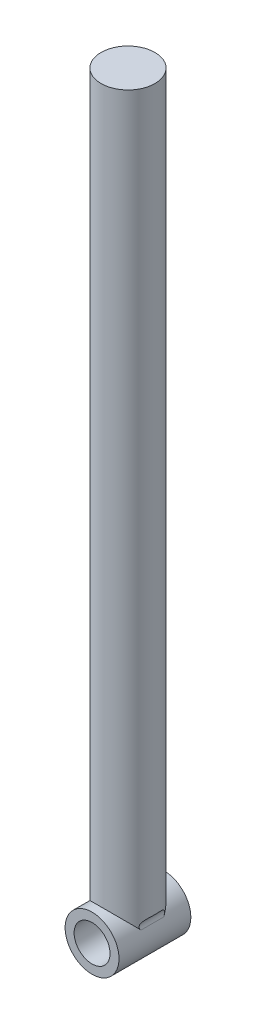
ISO-10303-21;
HEADER;
FILE_DESCRIPTION(('STEP AP214'),'2;1');
FILE_NAME('part.step','',(''),(''),'','','');
FILE_SCHEMA(('AUTOMOTIVE_DESIGN { 1 0 10303 214 1 1 1 1 }'));
ENDSEC;
DATA;
#1=APPLICATION_CONTEXT('core data for automotive mechanical design processes');
#2=APPLICATION_PROTOCOL_DEFINITION('international standard','automotive_design',2000,#1);
#3=PRODUCT_CONTEXT('',#1,'mechanical');
#4=PRODUCT('Part','Part','',(#3));
#5=PRODUCT_RELATED_PRODUCT_CATEGORY('part','',(#4));
#6=PRODUCT_DEFINITION_FORMATION('','',#4);
#7=PRODUCT_DEFINITION_CONTEXT('part definition',#1,'design');
#8=PRODUCT_DEFINITION('design','',#6,#7);
#9=PRODUCT_DEFINITION_SHAPE('','',#8);
#10=(LENGTH_UNIT() NAMED_UNIT(*) SI_UNIT(.MILLI.,.METRE.));
#11=(NAMED_UNIT(*) PLANE_ANGLE_UNIT() SI_UNIT($,.RADIAN.));
#12=(NAMED_UNIT(*) SI_UNIT($,.STERADIAN.) SOLID_ANGLE_UNIT());
#13=UNCERTAINTY_MEASURE_WITH_UNIT(LENGTH_MEASURE(1.E-05),#10,'distance_accuracy_value','');
#14=(GEOMETRIC_REPRESENTATION_CONTEXT(3) GLOBAL_UNCERTAINTY_ASSIGNED_CONTEXT((#13)) GLOBAL_UNIT_ASSIGNED_CONTEXT((#10,
#11,#12)) REPRESENTATION_CONTEXT('',''));
#15=CARTESIAN_POINT('',(0.,0.,0.));
#16=DIRECTION('',(0.,0.,1.));
#17=DIRECTION('',(1.,0.,0.));
#18=AXIS2_PLACEMENT_3D('',#15,#16,#17);
#19=CARTESIAN_POINT('',(0.,0.,100.));
#20=DIRECTION('',(0.,0.,-1.));
#21=DIRECTION('',(-1.,0.,0.));
#22=AXIS2_PLACEMENT_3D('',#19,#20,#21);
#23=CYLINDRICAL_SURFACE('',#22,37.5);
#24=CARTESIAN_POINT('',(0.,0.,0.));
#25=DIRECTION('',(0.,0.,1.));
#26=DIRECTION('',(1.,0.,0.));
#27=AXIS2_PLACEMENT_3D('',#24,#25,#26);
#28=CIRCLE('',#27,37.5);
#29=CARTESIAN_POINT('',(37.5,0.,0.));
#30=VERTEX_POINT('',#29);
#31=EDGE_CURVE('E116',#30,#30,#28,.T.);
#32=ORIENTED_EDGE('',*,*,#31,.T.);
#33=EDGE_LOOP('',(#32));
#34=FACE_BOUND('',#33,.T.);
#35=CARTESIAN_POINT('',(0.,0.,100.));
#36=DIRECTION('',(0.,0.,1.));
#37=DIRECTION('',(1.,0.,0.));
#38=AXIS2_PLACEMENT_3D('',#35,#36,#37);
#39=CIRCLE('',#38,37.5);
#40=CARTESIAN_POINT('',(37.5,0.,100.));
#41=VERTEX_POINT('',#40);
#42=EDGE_CURVE('E121',#41,#41,#39,.T.);
#43=ORIENTED_EDGE('',*,*,#42,.F.);
#44=EDGE_LOOP('',(#43));
#45=FACE_BOUND('',#44,.T.);
#46=CARTESIAN_POINT('',(0.,0.,50.));
#47=DIRECTION('',(0.,-0.707106781186547,-0.707106781186547));
#48=DIRECTION('',(0.,0.707106781186547,-0.707106781186547));
#49=AXIS2_PLACEMENT_3D('',#46,#47,#48);
#50=ELLIPSE('',#49,53.0330085889911,37.5);
#51=CARTESIAN_POINT('',(34.0138577755541,15.7894736842105,34.2105263157895));
#52=VERTEX_POINT('',#51);
#53=CARTESIAN_POINT('',(-34.0138577755541,15.7894736842105,34.2105263157895));
#54=VERTEX_POINT('',#53);
#55=EDGE_CURVE('E56',#52,#54,#50,.F.);
#56=ORIENTED_EDGE('',*,*,#55,.F.);
#57=DIRECTION('',(0.,0.,-1.));
#58=VECTOR('',#57,1.);
#59=CARTESIAN_POINT('',(34.0138577755541,15.7894736842105,100.));
#60=LINE('',#59,#58);
#61=CARTESIAN_POINT('',(34.0138577755541,15.7894736842105,65.7894736842105));
#62=VERTEX_POINT('',#61);
#63=EDGE_CURVE('E72',#52,#62,#60,.F.);
#64=ORIENTED_EDGE('',*,*,#63,.T.);
#65=CARTESIAN_POINT('',(0.,0.,50.));
#66=DIRECTION('',(0.,0.707106781186547,-0.707106781186547));
#67=DIRECTION('',(0.,-0.707106781186547,-0.707106781186547));
#68=AXIS2_PLACEMENT_3D('',#65,#66,#67);
#69=ELLIPSE('',#68,53.0330085889911,37.5);
#70=CARTESIAN_POINT('',(-34.0138577755541,15.7894736842105,65.7894736842105));
#71=VERTEX_POINT('',#70);
#72=EDGE_CURVE('E62',#71,#62,#69,.T.);
#73=ORIENTED_EDGE('',*,*,#72,.F.);
#74=DIRECTION('',(0.,0.,-1.));
#75=VECTOR('',#74,1.);
#76=CARTESIAN_POINT('',(-34.0138577755541,15.7894736842105,100.));
#77=LINE('',#76,#75);
#78=EDGE_CURVE('E69',#71,#54,#77,.T.);
#79=ORIENTED_EDGE('',*,*,#78,.T.);
#80=EDGE_LOOP('',(#56,#64,#73,#79));
#81=FACE_BOUND('',#80,.T.);
#82=ADVANCED_FACE('F33',(#34,#45,#81),#23,.T.);
#83=CARTESIAN_POINT('',(0.,0.,100.));
#84=DIRECTION('',(0.,0.,1.));
#85=DIRECTION('',(1.,0.,0.));
#86=AXIS2_PLACEMENT_3D('',#83,#84,#85);
#87=PLANE('',#86);
#88=ORIENTED_EDGE('',*,*,#42,.T.);
#89=EDGE_LOOP('',(#88));
#90=FACE_BOUND('',#89,.T.);
#91=CARTESIAN_POINT('',(0.,0.,100.));
#92=DIRECTION('',(0.,0.,1.));
#93=DIRECTION('',(1.,0.,0.));
#94=AXIS2_PLACEMENT_3D('',#91,#92,#93);
#95=CIRCLE('',#94,25.);
#96=CARTESIAN_POINT('',(25.,0.,100.));
#97=VERTEX_POINT('',#96);
#98=EDGE_CURVE('E109',#97,#97,#95,.T.);
#99=ORIENTED_EDGE('',*,*,#98,.F.);
#100=EDGE_LOOP('',(#99));
#101=FACE_BOUND('',#100,.T.);
#102=ADVANCED_FACE('F91',(#90,#101),#87,.T.);
#103=CARTESIAN_POINT('',(0.,0.,0.));
#104=DIRECTION('',(0.,0.,1.));
#105=DIRECTION('',(1.,0.,0.));
#106=AXIS2_PLACEMENT_3D('',#103,#104,#105);
#107=PLANE('',#106);
#108=ORIENTED_EDGE('',*,*,#31,.F.);
#109=EDGE_LOOP('',(#108));
#110=FACE_BOUND('',#109,.T.);
#111=CARTESIAN_POINT('',(0.,0.,0.));
#112=DIRECTION('',(0.,0.,1.));
#113=DIRECTION('',(1.,0.,0.));
#114=AXIS2_PLACEMENT_3D('',#111,#112,#113);
#115=CIRCLE('',#114,25.);
#116=CARTESIAN_POINT('',(25.,0.,0.));
#117=VERTEX_POINT('',#116);
#118=EDGE_CURVE('E112',#117,#117,#115,.T.);
#119=ORIENTED_EDGE('',*,*,#118,.T.);
#120=EDGE_LOOP('',(#119));
#121=FACE_BOUND('',#120,.T.);
#122=ADVANCED_FACE('F93',(#110,#121),#107,.F.);
#123=CARTESIAN_POINT('',(0.,0.,100.));
#124=DIRECTION('',(0.,0.,-1.));
#125=DIRECTION('',(-1.,0.,0.));
#126=AXIS2_PLACEMENT_3D('',#123,#124,#125);
#127=CYLINDRICAL_SURFACE('',#126,25.);
#128=ORIENTED_EDGE('',*,*,#98,.T.);
#129=EDGE_LOOP('',(#128));
#130=FACE_BOUND('',#129,.T.);
#131=ORIENTED_EDGE('',*,*,#118,.F.);
#132=EDGE_LOOP('',(#131));
#133=FACE_BOUND('',#132,.T.);
#134=ADVANCED_FACE('F96',(#130,#133),#127,.F.);
#135=CARTESIAN_POINT('',(0.,1030.,50.));
#136=DIRECTION('',(0.,-1.,0.));
#137=DIRECTION('',(0.,0.,-1.));
#138=AXIS2_PLACEMENT_3D('',#135,#136,#137);
#139=CYLINDRICAL_SURFACE('',#138,37.5);
#140=CARTESIAN_POINT('',(0.,1030.,50.));
#141=DIRECTION('',(0.,1.,0.));
#142=DIRECTION('',(0.,0.,1.));
#143=AXIS2_PLACEMENT_3D('',#140,#141,#142);
#144=CIRCLE('',#143,37.5);
#145=CARTESIAN_POINT('',(0.,1030.,87.5));
#146=VERTEX_POINT('',#145);
#147=EDGE_CURVE('E114',#146,#146,#144,.T.);
#148=ORIENTED_EDGE('',*,*,#147,.F.);
#149=EDGE_LOOP('',(#148));
#150=FACE_BOUND('',#149,.T.);
#151=ORIENTED_EDGE('',*,*,#72,.T.);
#152=CARTESIAN_POINT('',(34.0138577755541,15.7894736842105,65.7894736842105));
#153=CARTESIAN_POINT('',(33.9642878820312,15.8962872373078,65.8962634843181));
#154=CARTESIAN_POINT('',(33.9154762374389,16.0063536010358,66.0000897885189));
#155=CARTESIAN_POINT('',(33.8198875735482,16.2333813568825,66.2011600220385));
#156=CARTESIAN_POINT('',(33.773112617909,16.3503494720273,66.298397328142));
#157=CARTESIAN_POINT('',(33.635931878879,16.7140804915408,66.5806501815352));
#158=CARTESIAN_POINT('',(33.5496039439611,16.9717155827864,66.7542118682542));
#159=CARTESIAN_POINT('',(33.432718927983,17.3791752114855,66.9856097414164));
#160=CARTESIAN_POINT('',(33.3957532526067,17.5190138203539,67.0581171558005));
#161=CARTESIAN_POINT('',(33.3269731714086,17.8050653826979,67.1921058884076));
#162=CARTESIAN_POINT('',(33.2951559972247,17.9512748564987,67.2535931341296));
#163=CARTESIAN_POINT('',(33.2375792410671,18.248842165094,67.3642511322928));
#164=CARTESIAN_POINT('',(33.2117985932779,18.4001799205467,67.4134647566718));
#165=CARTESIAN_POINT('',(33.1668893929903,18.7074633952213,67.4988508529805));
#166=CARTESIAN_POINT('',(33.1477601040685,18.8634086022411,67.5350247686535));
#167=CARTESIAN_POINT('',(33.1175894019325,19.1701038676809,67.5919372094657));
#168=CARTESIAN_POINT('',(33.1061679762356,19.3206815639534,67.613401940402));
#169=CARTESIAN_POINT('',(33.0901608367519,19.6234837925999,67.643456281645));
#170=CARTESIAN_POINT('',(33.0855749493653,19.775708283052,67.6520462189285));
#171=CARTESIAN_POINT('',(33.0833819399097,20.0804606076228,67.6561560035756));
#172=CARTESIAN_POINT('',(33.0857783675997,20.232988556628,67.6516692028187));
#173=CARTESIAN_POINT('',(33.0974822717815,20.5368282997225,67.6297141481021));
#174=CARTESIAN_POINT('',(33.1067892809154,20.6881401753544,67.6122467720097));
#175=CARTESIAN_POINT('',(33.1304511417152,20.9694624262956,67.5676906174669));
#176=CARTESIAN_POINT('',(33.1440311462645,21.0997747205266,67.5420744920933));
#177=CARTESIAN_POINT('',(33.17595776447,21.3576632454756,67.481618501095));
#178=CARTESIAN_POINT('',(33.1943058026236,21.4852386461676,67.4467758789032));
#179=CARTESIAN_POINT('',(33.2559292381143,21.8626694282765,67.3291969246159));
#180=CARTESIAN_POINT('',(33.3058050125325,22.1074673722929,67.2333705191858));
#181=CARTESIAN_POINT('',(33.4406932507744,22.6670903228514,66.9705323531215));
#182=CARTESIAN_POINT('',(33.5318756308039,22.9741513281362,66.7903004503929));
#183=CARTESIAN_POINT('',(33.7312620874311,23.5519163179604,66.3860511230212));
#184=CARTESIAN_POINT('',(33.8395022932417,23.8225408196063,66.1619405114563));
#185=CARTESIAN_POINT('',(34.0366764576925,24.2643658374633,65.7414866928417));
#186=CARTESIAN_POINT('',(34.1236254710339,24.4434601082312,65.5523210480317));
#187=CARTESIAN_POINT('',(34.300177503638,24.7830163358762,65.158966558348));
#188=CARTESIAN_POINT('',(34.3897818641468,24.9434686679984,64.9547700411877));
#189=CARTESIAN_POINT('',(34.5697053163528,25.247309187281,64.534026610829));
#190=CARTESIAN_POINT('',(34.6600251549495,25.3906760245813,64.3174647353636));
#191=CARTESIAN_POINT('',(34.8397744735597,25.6617643499489,63.8743399534406));
#192=CARTESIAN_POINT('',(34.9292036156514,25.7894800934082,63.647773416112));
#193=CARTESIAN_POINT('',(35.0940383557911,26.0144599049136,63.2175701703041));
#194=CARTESIAN_POINT('',(35.1697090461582,26.1135080279007,63.0149604572908));
#195=CARTESIAN_POINT('',(35.3188962731979,26.3019176131673,62.6044954336533));
#196=CARTESIAN_POINT('',(35.3924124759547,26.3912775796493,62.3966393191042));
#197=CARTESIAN_POINT('',(35.6090552384105,26.6461917547014,61.7661559557962));
#198=CARTESIAN_POINT('',(35.7482177763575,26.7985032042426,61.3367646867513));
#199=CARTESIAN_POINT('',(36.0134705457041,27.0739700605959,60.4636961373576));
#200=CARTESIAN_POINT('',(36.1395260347612,27.1970490367188,60.0199847790123));
#201=CARTESIAN_POINT('',(36.3764290454104,27.4183422946209,59.1225401020452));
#202=CARTESIAN_POINT('',(36.4872787784654,27.5165601938534,58.6688082519305));
#203=CARTESIAN_POINT('',(36.6755378520804,27.6773300193163,57.829928548996));
#204=CARTESIAN_POINT('',(36.7554419018824,27.7430976042256,57.4459425895645));
#205=CARTESIAN_POINT('',(36.9034737753542,27.861767303101,56.6736941356446));
#206=CARTESIAN_POINT('',(36.9716001891789,27.9146678771261,56.2854311350809));
#207=CARTESIAN_POINT('',(37.0957801207075,28.0090365183812,55.5053777475623));
#208=CARTESIAN_POINT('',(37.1518265577571,28.0504978845081,55.113585431301));
#209=CARTESIAN_POINT('',(37.2515735969771,28.1230559780464,54.3274974204948));
#210=CARTESIAN_POINT('',(37.2952745814703,28.1541530264326,53.9332018038607));
#211=CARTESIAN_POINT('',(37.3701256841485,28.2067786043814,53.1433795390043));
#212=CARTESIAN_POINT('',(37.4012942079908,28.2283211708562,52.7478555621203));
#213=CARTESIAN_POINT('',(37.4510746016679,28.2624804970135,51.9556413904449));
#214=CARTESIAN_POINT('',(37.469686604136,28.2750973509776,51.5589512080166));
#215=CARTESIAN_POINT('',(37.4942940123023,28.2917399056368,50.7651852282684));
#216=CARTESIAN_POINT('',(37.5002952961254,28.2957696089981,50.3681096969586));
#217=CARTESIAN_POINT('',(37.4996823395263,28.2953561864696,49.573970944401));
#218=CARTESIAN_POINT('',(37.493067892318,28.2909129216981,49.1769077234617));
#219=CARTESIAN_POINT('',(37.4645998010134,28.2716536600422,48.3022532922305));
#220=CARTESIAN_POINT('',(37.4399073746372,28.2549029511491,47.8247927600005));
#221=CARTESIAN_POINT('',(37.3723531733587,28.2083043644452,46.8718430529099));
#222=CARTESIAN_POINT('',(37.3294931148074,28.1784577238372,46.3963536961102));
#223=CARTESIAN_POINT('',(37.2256665937374,28.1044083610313,45.4471665194284));
#224=CARTESIAN_POINT('',(37.1646517027296,28.0601672112162,44.973476967355));
#225=CARTESIAN_POINT('',(37.0248773352917,27.9556280984839,44.0304427714362));
#226=CARTESIAN_POINT('',(36.9461170548797,27.8953294080328,43.5610983254558));
#227=CARTESIAN_POINT('',(36.8015330769604,27.78030512828,42.7893287137332));
#228=CARTESIAN_POINT('',(36.7406224348393,27.7308353797122,42.4851866912432));
#229=CARTESIAN_POINT('',(36.6116195840222,27.6231568388893,41.8799615088542));
#230=CARTESIAN_POINT('',(36.5435271350246,27.5649477541906,41.5788784516773));
#231=CARTESIAN_POINT('',(36.4003722166933,27.4387695396831,40.9801483119276));
#232=CARTESIAN_POINT('',(36.3253039248814,27.370792230371,40.6825043370505));
#233=CARTESIAN_POINT('',(36.1686055703154,27.223974767788,40.0916514395257));
#234=CARTESIAN_POINT('',(36.0869757527234,27.145135020298,39.7984423516607));
#235=CARTESIAN_POINT('',(35.9181445838547,26.9757851037615,39.2191209726603));
#236=CARTESIAN_POINT('',(35.8309804063855,26.8853493464062,38.9329762211585));
#237=CARTESIAN_POINT('',(35.6512421898272,26.6909177120194,38.3669829704599));
#238=CARTESIAN_POINT('',(35.5586674101716,26.5869199763063,38.0871353404647));
#239=CARTESIAN_POINT('',(35.3691188311248,26.3638515164474,37.5356388291751));
#240=CARTESIAN_POINT('',(35.2721530806997,26.2448077080302,37.2639763545157));
#241=CARTESIAN_POINT('',(35.0748118990635,25.9896084090954,36.7301681852002));
#242=CARTESIAN_POINT('',(34.9744380732386,25.8534608959273,36.4680181268449));
#243=CARTESIAN_POINT('',(34.8075873280561,25.613421645646,36.0460155171917));
#244=CARTESIAN_POINT('',(34.7416652724685,25.515131261506,35.8827472950153));
#245=CARTESIAN_POINT('',(34.6095415857095,25.3098712608948,35.5618660446429));
#246=CARTESIAN_POINT('',(34.5433399737957,25.2029022333126,35.4042526337848));
#247=CARTESIAN_POINT('',(34.4112235131831,24.9795565001418,35.0954393239597));
#248=CARTESIAN_POINT('',(34.3453089852004,24.863171210624,34.9442454729506));
#249=CARTESIAN_POINT('',(34.2145921915279,24.6204658102061,34.6495059810931));
#250=CARTESIAN_POINT('',(34.1497899422465,24.4941455528982,34.5059604530074));
#251=CARTESIAN_POINT('',(34.0215561297018,24.2296508242459,34.2263633112012));
#252=CARTESIAN_POINT('',(33.9581457818121,24.0913668975179,34.0904049720306));
#253=CARTESIAN_POINT('',(33.8345263606944,23.8036420793849,33.8291710317021));
#254=CARTESIAN_POINT('',(33.7743176111184,23.6542000636576,33.7038965098092));
#255=CARTESIAN_POINT('',(33.658540023078,23.3442258295003,33.4660911335266));
#256=CARTESIAN_POINT('',(33.6029625643986,23.1837152793981,33.3535364579553));
#257=CARTESIAN_POINT('',(33.4978364026082,22.851603845307,33.1429894237339));
#258=CARTESIAN_POINT('',(33.448286794963,22.6800046312057,33.0449948797132));
#259=CARTESIAN_POINT('',(33.3380229702683,22.2534010387766,32.8289070741472));
#260=CARTESIAN_POINT('',(33.2810666542496,21.9930582412115,32.7190586991198));
#261=CARTESIAN_POINT('',(33.2105229871747,21.5902245011059,32.5840955293961));
#262=CARTESIAN_POINT('',(33.1894867148979,21.4538564171248,32.5440695364166));
#263=CARTESIAN_POINT('',(33.1528429553359,21.1777516841895,32.4745740871684));
#264=CARTESIAN_POINT('',(33.1372333789941,21.0380163536889,32.4451005684965));
#265=CARTESIAN_POINT('',(33.1117672435584,20.7552900139075,32.3971134292601));
#266=CARTESIAN_POINT('',(33.101945655912,20.6122845299385,32.3786664222967));
#267=CARTESIAN_POINT('',(33.0884665752408,20.324955317227,32.3533689543304));
#268=CARTESIAN_POINT('',(33.0848090800335,20.1806315889513,32.3465184892215));
#269=CARTESIAN_POINT('',(33.083762540509,19.892010661208,32.3445572890287));
#270=CARTESIAN_POINT('',(33.0863679182307,19.7477135525198,32.3494361073838));
#271=CARTESIAN_POINT('',(33.097761430939,19.4602385457143,32.3708101760652));
#272=CARTESIAN_POINT('',(33.1065492812552,19.3170605963725,32.3873048915403));
#273=CARTESIAN_POINT('',(33.1291519369301,19.0440190956777,32.4298599632165));
#274=CARTESIAN_POINT('',(33.1425225517494,18.913986180006,32.4550764586624));
#275=CARTESIAN_POINT('',(33.1740149880056,18.6566145688114,32.5146958980764));
#276=CARTESIAN_POINT('',(33.1921385530104,18.5292768805674,32.5491022133153));
#277=CARTESIAN_POINT('',(33.2532171300379,18.1516672541999,32.6656036879784));
#278=CARTESIAN_POINT('',(33.3028285663,17.9063909568275,32.7608861405223));
#279=CARTESIAN_POINT('',(33.402240406352,17.4913710172732,32.9545003334021));
#280=CARTESIAN_POINT('',(33.4490434135429,17.3177958743209,33.0464201403097));
#281=CARTESIAN_POINT('',(33.5491389373054,16.9812188458289,33.2453677781182));
#282=CARTESIAN_POINT('',(33.6024390083161,16.8182296129797,33.3524132197613));
#283=CARTESIAN_POINT('',(33.7135634852374,16.5045245432436,33.5786314003377));
#284=CARTESIAN_POINT('',(33.7713535352313,16.3537306390732,33.697713811996));
#285=CARTESIAN_POINT('',(33.8903420378138,16.0633660560948,33.9465301115385));
#286=CARTESIAN_POINT('',(33.9515311149446,15.923766870556,34.0762351270261));
#287=CARTESIAN_POINT('',(34.0138577755541,15.7894736842105,34.2105263157895));
#288=B_SPLINE_CURVE_WITH_KNOTS('',3,(#152,#153,#154,#155,#156,#157,#158,#159,#160,#161,#162,
#163,#164,#165,#166,#167,#168,#169,#170,#171,#172,#173,#174,#175,#176,#177,#178,#179,#180,#181,
#182,#183,#184,#185,#186,#187,#188,#189,#190,#191,#192,#193,#194,#195,#196,#197,#198,#199,#200,
#201,#202,#203,#204,#205,#206,#207,#208,#209,#210,#211,#212,#213,#214,#215,#216,#217,#218,#219,
#220,#221,#222,#223,#224,#225,#226,#227,#228,#229,#230,#231,#232,#233,#234,#235,#236,#237,#238,
#239,#240,#241,#242,#243,#244,#245,#246,#247,#248,#249,#250,#251,#252,#253,#254,#255,#256,#257,
#258,#259,#260,#261,#262,#263,#264,#265,#266,#267,#268,#269,#270,#271,#272,#273,#274,#275,#276,
#277,#278,#279,#280,#281,#282,#283,#284,#285,#286,#287),.UNSPECIFIED.,.F.,.F.,(4,2,2,2,2,2,2,2,
2,2,2,2,2,2,2,2,2,2,2,2,2,2,2,2,2,2,2,2,2,2,2,2,2,2,2,2,2,2,2,2,2,2,2,2,2,2,2,2,2,2,2,2,2,2,2,2,
2,2,2,2,2,2,2,2,2,2,2,4),(0.,0.476725813261012,0.953923929496935,1.91709481622202,
2.40202752674864,2.88669861501103,3.36965225080255,3.85255239802123,4.30945222424295,
4.76634044653845,5.22346098806225,5.68055061765624,6.08060046419302,6.4807699672834,
7.28039100014535,8.37702792091735,9.47601958134354,10.2988016572965,11.1220066620184,
11.9462297824555,12.770754526972,13.4841120135688,14.1975794822028,15.6250501462625,
17.0562129452556,18.4871673805983,19.67982175802,20.8726188037598,22.066113115121,
23.2595704614404,24.4512685912581,25.6429541330788,26.8340840815401,28.0252335541533,
29.459876576655,30.89438409429,32.3327530373685,33.7711871610537,34.7133012771596,
35.655446926176,36.5983861361559,37.5412901309237,38.4784208805608,39.4156802000638,
40.3512859896916,41.2864570117861,41.8911843700144,42.4958707287586,43.1011146728478,
43.7063675378544,44.3179041695104,44.9295025047884,45.5399357891413,46.1502773591059,
47.0109853184678,47.4415623764704,47.8719734958378,48.3049592127918,48.7379447764345,
49.1705448489954,49.6031250038937,50.0020570536238,50.401135652432,51.2010790596272,
51.8059142529687,52.4114595477194,53.012757539633,53.6124722340481),.UNSPECIFIED.);
#289=EDGE_CURVE('E48',#62,#52,#288,.T.);
#290=ORIENTED_EDGE('',*,*,#289,.T.);
#291=ORIENTED_EDGE('',*,*,#55,.T.);
#292=CARTESIAN_POINT('',(-34.0138577755541,15.7894736842105,34.2105263157895));
#293=CARTESIAN_POINT('',(-33.9642878820312,15.8962872373079,34.1037365156819));
#294=CARTESIAN_POINT('',(-33.9154762374389,16.0063536010358,33.9999102114811));
#295=CARTESIAN_POINT('',(-33.8198875735482,16.2333813568825,33.7988399779615));
#296=CARTESIAN_POINT('',(-33.773112617909,16.3503494720273,33.7016026718581));
#297=CARTESIAN_POINT('',(-33.635931878879,16.7140804915408,33.4193498184648));
#298=CARTESIAN_POINT('',(-33.5496039439611,16.9717155827864,33.2457881317458));
#299=CARTESIAN_POINT('',(-33.432718927983,17.3791752114855,33.0143902585837));
#300=CARTESIAN_POINT('',(-33.3957532526067,17.5190138203539,32.9418828441995));
#301=CARTESIAN_POINT('',(-33.3269731714086,17.8050653826979,32.8078941115924));
#302=CARTESIAN_POINT('',(-33.2951559972247,17.9512748564987,32.7464068658704));
#303=CARTESIAN_POINT('',(-33.2375792410671,18.248842165094,32.6357488677072));
#304=CARTESIAN_POINT('',(-33.2117985932779,18.4001799205467,32.5865352433282));
#305=CARTESIAN_POINT('',(-33.1668893929903,18.7074633952213,32.5011491470195));
#306=CARTESIAN_POINT('',(-33.1477601040685,18.8634086022411,32.4649752313465));
#307=CARTESIAN_POINT('',(-33.1175894019325,19.1701038676809,32.4080627905343));
#308=CARTESIAN_POINT('',(-33.1061679762356,19.3206815639534,32.3865980595981));
#309=CARTESIAN_POINT('',(-33.0901608367519,19.6234837925999,32.356543718355));
#310=CARTESIAN_POINT('',(-33.0855749493653,19.775708283052,32.3479537810715));
#311=CARTESIAN_POINT('',(-33.0833819399097,20.0804606076228,32.3438439964244));
#312=CARTESIAN_POINT('',(-33.0857783675997,20.232988556628,32.3483307971813));
#313=CARTESIAN_POINT('',(-33.0974822717815,20.5368282997224,32.3702858518979));
#314=CARTESIAN_POINT('',(-33.1067892809154,20.6881401753544,32.3877532279903));
#315=CARTESIAN_POINT('',(-33.1304511417151,20.9694624262956,32.4323093825331));
#316=CARTESIAN_POINT('',(-33.1440311462645,21.0997747205266,32.4579255079067));
#317=CARTESIAN_POINT('',(-33.17595776447,21.3576632454756,32.5183814989051));
#318=CARTESIAN_POINT('',(-33.1943058026236,21.4852386461676,32.5532241210968));
#319=CARTESIAN_POINT('',(-33.2559292381143,21.8626694282765,32.6708030753841));
#320=CARTESIAN_POINT('',(-33.3058050125325,22.1074673722929,32.7666294808143));
#321=CARTESIAN_POINT('',(-33.4406932507744,22.6670903228514,33.0294676468786));
#322=CARTESIAN_POINT('',(-33.5318756308039,22.9741513281362,33.2096995496071));
#323=CARTESIAN_POINT('',(-33.7312620874311,23.5519163179604,33.6139488769788));
#324=CARTESIAN_POINT('',(-33.8395022932417,23.8225408196063,33.8380594885438));
#325=CARTESIAN_POINT('',(-34.0366764576925,24.2643658374633,34.2585133071584));
#326=CARTESIAN_POINT('',(-34.1236254710339,24.4434601082312,34.4476789519683));
#327=CARTESIAN_POINT('',(-34.300177503638,24.7830163358762,34.841033441652));
#328=CARTESIAN_POINT('',(-34.3897818641468,24.9434686679984,35.0452299588123));
#329=CARTESIAN_POINT('',(-34.5697053163528,25.247309187281,35.465973389171));
#330=CARTESIAN_POINT('',(-34.6600251549495,25.3906760245813,35.6825352646364));
#331=CARTESIAN_POINT('',(-34.8397744735598,25.6617643499489,36.1256600465594));
#332=CARTESIAN_POINT('',(-34.9292036156514,25.7894800934082,36.3522265838881));
#333=CARTESIAN_POINT('',(-35.0940383557911,26.0144599049135,36.7824298296959));
#334=CARTESIAN_POINT('',(-35.1697090461582,26.1135080279007,36.9850395427093));
#335=CARTESIAN_POINT('',(-35.3188962731979,26.3019176131673,37.3955045663467));
#336=CARTESIAN_POINT('',(-35.3924124759547,26.3912775796493,37.6033606808959));
#337=CARTESIAN_POINT('',(-35.6090552384105,26.6461917547014,38.2338440442038));
#338=CARTESIAN_POINT('',(-35.7482177763575,26.7985032042426,38.6632353132487));
#339=CARTESIAN_POINT('',(-36.0134705457041,27.0739700605959,39.5363038626424));
#340=CARTESIAN_POINT('',(-36.1395260347612,27.1970490367188,39.9800152209878));
#341=CARTESIAN_POINT('',(-36.3764290454104,27.4183422946209,40.8774598979548));
#342=CARTESIAN_POINT('',(-36.4872787784654,27.5165601938534,41.3311917480696));
#343=CARTESIAN_POINT('',(-36.6755378520804,27.6773300193163,42.1700714510041));
#344=CARTESIAN_POINT('',(-36.7554419018824,27.7430976042256,42.5540574104356));
#345=CARTESIAN_POINT('',(-36.9034737753542,27.861767303101,43.3263058643555));
#346=CARTESIAN_POINT('',(-36.9716001891789,27.9146678771261,43.7145688649191));
#347=CARTESIAN_POINT('',(-37.0957801207075,28.0090365183812,44.4946222524378));
#348=CARTESIAN_POINT('',(-37.1518265577571,28.0504978845081,44.8864145686991));
#349=CARTESIAN_POINT('',(-37.2515735969771,28.1230559780464,45.6725025795052));
#350=CARTESIAN_POINT('',(-37.2952745814703,28.1541530264327,46.0667981961393));
#351=CARTESIAN_POINT('',(-37.3701256841485,28.2067786043814,46.8566204609957));
#352=CARTESIAN_POINT('',(-37.4012942079908,28.2283211708562,47.2521444378798));
#353=CARTESIAN_POINT('',(-37.4510746016679,28.2624804970135,48.0443586095551));
#354=CARTESIAN_POINT('',(-37.469686604136,28.2750973509776,48.4410487919834));
#355=CARTESIAN_POINT('',(-37.4942940123023,28.2917399056368,49.2348147717316));
#356=CARTESIAN_POINT('',(-37.5002952961254,28.2957696089981,49.6318903030415));
#357=CARTESIAN_POINT('',(-37.4996823395263,28.2953561864696,50.426029055599));
#358=CARTESIAN_POINT('',(-37.493067892318,28.2909129216981,50.8230922765383));
#359=CARTESIAN_POINT('',(-37.4645998010134,28.2716536600422,51.6977467077695));
#360=CARTESIAN_POINT('',(-37.4399073746372,28.2549029511491,52.1752072399995));
#361=CARTESIAN_POINT('',(-37.3723531733587,28.2083043644452,53.12815694709));
#362=CARTESIAN_POINT('',(-37.3294931148074,28.1784577238372,53.6036463038897));
#363=CARTESIAN_POINT('',(-37.2256665937374,28.1044083610314,54.5528334805715));
#364=CARTESIAN_POINT('',(-37.1646517027296,28.0601672112163,55.0265230326449));
#365=CARTESIAN_POINT('',(-37.0248773352917,27.9556280984839,55.9695572285637));
#366=CARTESIAN_POINT('',(-36.9461170548797,27.8953294080328,56.4389016745441));
#367=CARTESIAN_POINT('',(-36.8015330769604,27.78030512828,57.2106712862666));
#368=CARTESIAN_POINT('',(-36.7406224348393,27.7308353797122,57.5148133087567));
#369=CARTESIAN_POINT('',(-36.6116195840222,27.6231568388893,58.1200384911456));
#370=CARTESIAN_POINT('',(-36.5435271350246,27.5649477541907,58.4211215483226));
#371=CARTESIAN_POINT('',(-36.4003722166933,27.4387695396831,59.0198516880723));
#372=CARTESIAN_POINT('',(-36.3253039248814,27.370792230371,59.3174956629493));
#373=CARTESIAN_POINT('',(-36.1686055703155,27.2239747677881,59.9083485604741));
#374=CARTESIAN_POINT('',(-36.0869757527234,27.1451350202981,60.2015576483392));
#375=CARTESIAN_POINT('',(-35.9181445838548,26.9757851037615,60.7808790273396));
#376=CARTESIAN_POINT('',(-35.8309804063856,26.8853493464063,61.0670237788414));
#377=CARTESIAN_POINT('',(-35.6512421898273,26.6909177120194,61.63301702954));
#378=CARTESIAN_POINT('',(-35.5586674101716,26.5869199763063,61.9128646595352));
#379=CARTESIAN_POINT('',(-35.3691188311248,26.3638515164474,62.4643611708248));
#380=CARTESIAN_POINT('',(-35.2721530806997,26.2448077080303,62.7360236454843));
#381=CARTESIAN_POINT('',(-35.0748118990635,25.9896084090954,63.2698318147997));
#382=CARTESIAN_POINT('',(-34.9744380732386,25.8534608959273,63.531981873155));
#383=CARTESIAN_POINT('',(-34.8075873280561,25.613421645646,63.9539844828083));
#384=CARTESIAN_POINT('',(-34.7416652724686,25.515131261506,64.1172527049846));
#385=CARTESIAN_POINT('',(-34.6095415857095,25.3098712608949,64.438133955357));
#386=CARTESIAN_POINT('',(-34.5433399737958,25.2029022333126,64.5957473662151));
#387=CARTESIAN_POINT('',(-34.4112235131831,24.9795565001419,64.9045606760403));
#388=CARTESIAN_POINT('',(-34.3453089852004,24.8631712106241,65.0557545270494));
#389=CARTESIAN_POINT('',(-34.2145921915279,24.6204658102062,65.3504940189069));
#390=CARTESIAN_POINT('',(-34.1497899422465,24.4941455528983,65.4940395469926));
#391=CARTESIAN_POINT('',(-34.0215561297018,24.2296508242459,65.7736366887987));
#392=CARTESIAN_POINT('',(-33.9581457818121,24.091366897518,65.9095950279694));
#393=CARTESIAN_POINT('',(-33.8345263606944,23.803642079385,66.1708289682979));
#394=CARTESIAN_POINT('',(-33.7743176111185,23.6542000636577,66.2961034901908));
#395=CARTESIAN_POINT('',(-33.6585400230781,23.3442258295003,66.5339088664734));
#396=CARTESIAN_POINT('',(-33.6029625643986,23.1837152793981,66.6464635420447));
#397=CARTESIAN_POINT('',(-33.4978364026082,22.8516038453071,66.8570105762661));
#398=CARTESIAN_POINT('',(-33.448286794963,22.6800046312058,66.9550051202868));
#399=CARTESIAN_POINT('',(-33.3380229702684,22.2534010387767,67.1710929258528));
#400=CARTESIAN_POINT('',(-33.2810666542496,21.9930582412116,67.2809413008802));
#401=CARTESIAN_POINT('',(-33.2105229871747,21.590224501106,67.4159044706039));
#402=CARTESIAN_POINT('',(-33.1894867148979,21.4538564171249,67.4559304635834));
#403=CARTESIAN_POINT('',(-33.1528429553359,21.1777516841896,67.5254259128316));
#404=CARTESIAN_POINT('',(-33.1372333789941,21.038016353689,67.5548994315035));
#405=CARTESIAN_POINT('',(-33.1117672435584,20.7552900139075,67.6028865707399));
#406=CARTESIAN_POINT('',(-33.101945655912,20.6122845299385,67.6213335777033));
#407=CARTESIAN_POINT('',(-33.0884665752408,20.3249553172271,67.6466310456696));
#408=CARTESIAN_POINT('',(-33.0848090800335,20.1806315889514,67.6534815107785));
#409=CARTESIAN_POINT('',(-33.083762540509,19.8920106612081,67.6554427109713));
#410=CARTESIAN_POINT('',(-33.0863679182307,19.7477135525199,67.6505638926163));
#411=CARTESIAN_POINT('',(-33.097761430939,19.4602385457144,67.6291898239349));
#412=CARTESIAN_POINT('',(-33.1065492812552,19.3170605963726,67.6126951084597));
#413=CARTESIAN_POINT('',(-33.1291519369301,19.0440190956777,67.5701400367836));
#414=CARTESIAN_POINT('',(-33.1425225517494,18.913986180006,67.5449235413376));
#415=CARTESIAN_POINT('',(-33.1740149880056,18.6566145688114,67.4853041019237));
#416=CARTESIAN_POINT('',(-33.1921385530104,18.5292768805675,67.4508977866847));
#417=CARTESIAN_POINT('',(-33.2532171300379,18.1516672542,67.3343963120216));
#418=CARTESIAN_POINT('',(-33.3028285663,17.9063909568276,67.2391138594778));
#419=CARTESIAN_POINT('',(-33.402240406352,17.4913710172732,67.0454996665979));
#420=CARTESIAN_POINT('',(-33.4490434135429,17.3177958743209,66.9535798596904));
#421=CARTESIAN_POINT('',(-33.5491389373054,16.9812188458289,66.7546322218818));
#422=CARTESIAN_POINT('',(-33.6024390083161,16.8182296129797,66.6475867802387));
#423=CARTESIAN_POINT('',(-33.7135634852373,16.5045245432436,66.4213685996624));
#424=CARTESIAN_POINT('',(-33.7713535352313,16.3537306390732,66.302286188004));
#425=CARTESIAN_POINT('',(-33.8903420378138,16.0633660560948,66.0534698884615));
#426=CARTESIAN_POINT('',(-33.9515311149446,15.923766870556,65.9237648729739));
#427=CARTESIAN_POINT('',(-34.0138577755541,15.7894736842105,65.7894736842105));
#428=B_SPLINE_CURVE_WITH_KNOTS('',3,(#292,#293,#294,#295,#296,#297,#298,#299,#300,#301,#302,
#303,#304,#305,#306,#307,#308,#309,#310,#311,#312,#313,#314,#315,#316,#317,#318,#319,#320,#321,
#322,#323,#324,#325,#326,#327,#328,#329,#330,#331,#332,#333,#334,#335,#336,#337,#338,#339,#340,
#341,#342,#343,#344,#345,#346,#347,#348,#349,#350,#351,#352,#353,#354,#355,#356,#357,#358,#359,
#360,#361,#362,#363,#364,#365,#366,#367,#368,#369,#370,#371,#372,#373,#374,#375,#376,#377,#378,
#379,#380,#381,#382,#383,#384,#385,#386,#387,#388,#389,#390,#391,#392,#393,#394,#395,#396,#397,
#398,#399,#400,#401,#402,#403,#404,#405,#406,#407,#408,#409,#410,#411,#412,#413,#414,#415,#416,
#417,#418,#419,#420,#421,#422,#423,#424,#425,#426,#427),.UNSPECIFIED.,.F.,.F.,(4,2,2,2,2,2,2,2,
2,2,2,2,2,2,2,2,2,2,2,2,2,2,2,2,2,2,2,2,2,2,2,2,2,2,2,2,2,2,2,2,2,2,2,2,2,2,2,2,2,2,2,2,2,2,2,2,
2,2,2,2,2,2,2,2,2,2,2,4),(0.,0.476725813261015,0.953923929496934,1.91709481622201,
2.40202752674864,2.88669861501103,3.36965225080255,3.85255239802123,4.30945222424296,
4.76634044653844,5.22346098806224,5.68055061765623,6.080600464193,6.48076996728339,
7.28039100014534,8.37702792091734,9.47601958134353,10.2988016572965,11.1220066620184,
11.9462297824554,12.770754526972,13.4841120135688,14.1975794822028,15.6250501462625,
17.0562129452556,18.4871673805983,19.67982175802,20.8726188037598,22.066113115121,
23.2595704614404,24.4512685912581,25.6429541330788,26.8340840815401,28.0252335541533,
29.4598765766549,30.8943840942899,32.3327530373684,33.7711871610535,34.7133012771594,
35.6554469261759,36.5983861361557,37.5412901309235,38.4784208805606,39.4156802000637,
40.3512859896915,41.286457011786,41.8911843700143,42.4958707287585,43.1011146728477,
43.7063675378543,44.3179041695104,44.9295025047884,45.5399357891413,46.1502773591058,
47.0109853184677,47.4415623764703,47.8719734958377,48.3049592127917,48.7379447764344,
49.1705448489953,49.6031250038936,50.0020570536238,50.401135652432,51.2010790596271,
51.8059142529687,52.4114595477193,53.012757539633,53.6124722340481),.UNSPECIFIED.);
#429=EDGE_CURVE('E11',#54,#71,#428,.T.);
#430=ORIENTED_EDGE('',*,*,#429,.T.);
#431=EDGE_LOOP('',(#151,#290,#291,#430));
#432=FACE_BOUND('',#431,.T.);
#433=ADVANCED_FACE('F65',(#150,#432),#139,.T.);
#434=CARTESIAN_POINT('',(0.,1030.,50.));
#435=DIRECTION('',(0.,1.,0.));
#436=DIRECTION('',(0.,0.,1.));
#437=AXIS2_PLACEMENT_3D('',#434,#435,#436);
#438=PLANE('',#437);
#439=ORIENTED_EDGE('',*,*,#147,.T.);
#440=EDGE_LOOP('',(#439));
#441=FACE_BOUND('',#440,.T.);
#442=ADVANCED_FACE('F87',(#441),#438,.T.);
#443=CARTESIAN_POINT('',(43.0842198490352,20.,100.));
#444=DIRECTION('',(0.,0.,-1.));
#445=DIRECTION('',(-1.,0.,0.));
#446=AXIS2_PLACEMENT_3D('',#443,#444,#445);
#447=CYLINDRICAL_SURFACE('',#446,10.);
#448=ORIENTED_EDGE('',*,*,#289,.F.);
#449=ORIENTED_EDGE('',*,*,#63,.F.);
#450=EDGE_LOOP('',(#448,#449));
#451=FACE_BOUND('',#450,.T.);
#452=ADVANCED_FACE('F83',(#451),#447,.F.);
#453=CARTESIAN_POINT('',(-43.0842198490352,20.,100.));
#454=DIRECTION('',(0.,0.,-1.));
#455=DIRECTION('',(-1.,0.,0.));
#456=AXIS2_PLACEMENT_3D('',#453,#454,#455);
#457=CYLINDRICAL_SURFACE('',#456,10.);
#458=ORIENTED_EDGE('',*,*,#429,.F.);
#459=ORIENTED_EDGE('',*,*,#78,.F.);
#460=EDGE_LOOP('',(#458,#459));
#461=FACE_BOUND('',#460,.T.);
#462=ADVANCED_FACE('F35',(#461),#457,.F.);
#463=CLOSED_SHELL('',(#82,#102,#122,#134,#433,#442,#452,#462));
#464=MANIFOLD_SOLID_BREP('B2',#463);
#465=ADVANCED_BREP_SHAPE_REPRESENTATION('',(#18,#464),#14);
#466=SHAPE_DEFINITION_REPRESENTATION(#9,#465);
ENDSEC;
END-ISO-10303-21;
